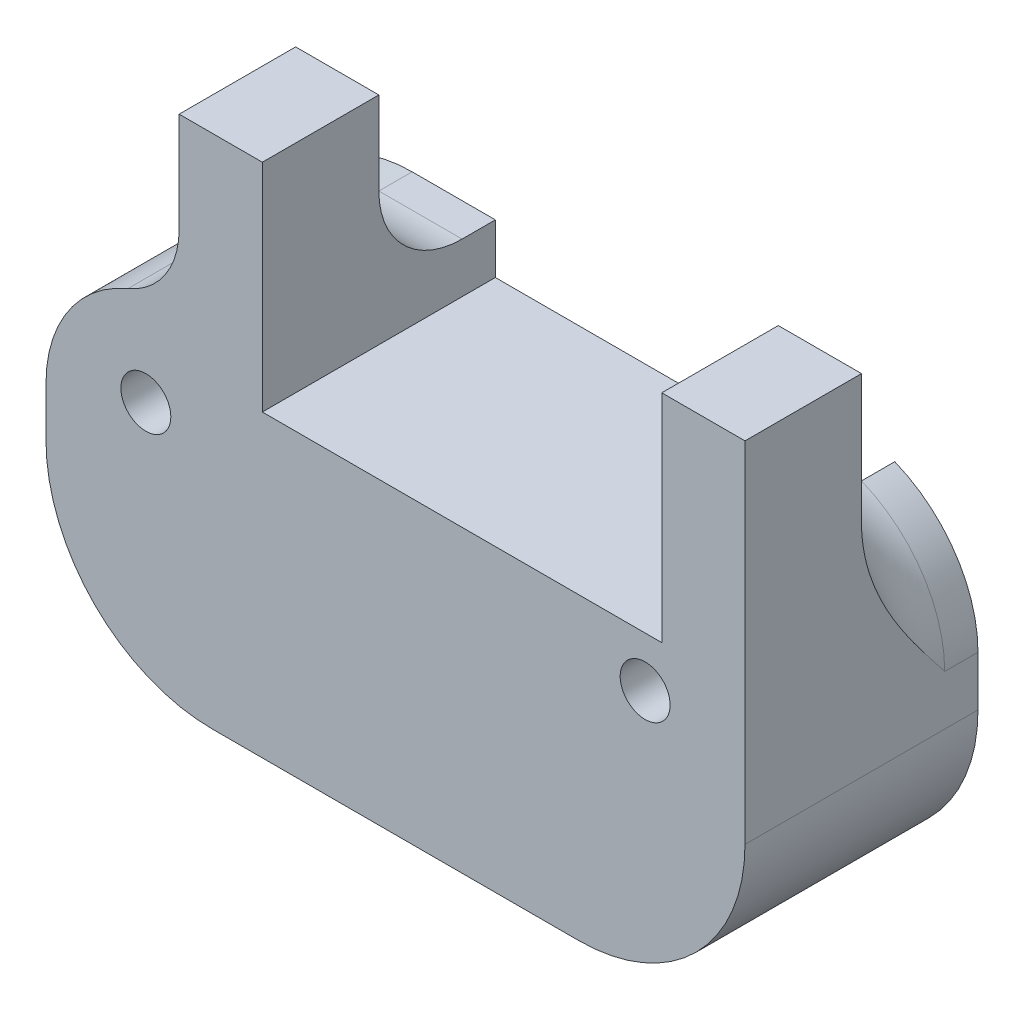
ISO-10303-21;
HEADER;
FILE_DESCRIPTION(('STEP AP214'),'2;1');
FILE_NAME('part.step','',(''),(''),'','','');
FILE_SCHEMA(('AUTOMOTIVE_DESIGN { 1 0 10303 214 1 1 1 1 }'));
ENDSEC;
DATA;
#1=APPLICATION_CONTEXT('core data for automotive mechanical design processes');
#2=APPLICATION_PROTOCOL_DEFINITION('international standard','automotive_design',2000,#1);
#3=PRODUCT_CONTEXT('',#1,'mechanical');
#4=PRODUCT('Part','Part','',(#3));
#5=PRODUCT_RELATED_PRODUCT_CATEGORY('part','',(#4));
#6=PRODUCT_DEFINITION_FORMATION('','',#4);
#7=PRODUCT_DEFINITION_CONTEXT('part definition',#1,'design');
#8=PRODUCT_DEFINITION('design','',#6,#7);
#9=PRODUCT_DEFINITION_SHAPE('','',#8);
#10=(LENGTH_UNIT() NAMED_UNIT(*) SI_UNIT(.MILLI.,.METRE.));
#11=(NAMED_UNIT(*) PLANE_ANGLE_UNIT() SI_UNIT($,.RADIAN.));
#12=(NAMED_UNIT(*) SI_UNIT($,.STERADIAN.) SOLID_ANGLE_UNIT());
#13=UNCERTAINTY_MEASURE_WITH_UNIT(LENGTH_MEASURE(1.E-05),#10,'distance_accuracy_value','');
#14=(GEOMETRIC_REPRESENTATION_CONTEXT(3) GLOBAL_UNCERTAINTY_ASSIGNED_CONTEXT((#13)) GLOBAL_UNIT_ASSIGNED_CONTEXT((#10,
#11,#12)) REPRESENTATION_CONTEXT('',''));
#15=CARTESIAN_POINT('',(0.,0.,0.));
#16=DIRECTION('',(0.,0.,1.));
#17=DIRECTION('',(1.,0.,0.));
#18=AXIS2_PLACEMENT_3D('',#15,#16,#17);
#19=CARTESIAN_POINT('',(-14.0928347928163,14.5093575102934,14.));
#20=DIRECTION('',(0.,-1.,0.));
#21=DIRECTION('',(0.,0.,-1.));
#22=AXIS2_PLACEMENT_3D('',#19,#20,#21);
#23=PLANE('',#22);
#24=DIRECTION('',(-1.,0.,0.));
#25=VECTOR('',#24,1.);
#26=CARTESIAN_POINT('',(-35.0928347928163,14.5093575102934,2.));
#27=LINE('',#26,#25);
#28=CARTESIAN_POINT('',(-40.0928347928163,14.5093575102934,2.));
#29=VERTEX_POINT('',#28);
#30=CARTESIAN_POINT('',(-35.0928347928163,14.5093575102934,2.));
#31=VERTEX_POINT('',#30);
#32=EDGE_CURVE('E322',#29,#31,#27,.F.);
#33=ORIENTED_EDGE('',*,*,#32,.T.);
#34=DIRECTION('',(0.,0.,1.));
#35=VECTOR('',#34,1.);
#36=CARTESIAN_POINT('',(-35.0928347928163,14.5093575102934,0.));
#37=LINE('',#36,#35);
#38=CARTESIAN_POINT('',(-35.0928347928163,14.5093575102934,0.));
#39=VERTEX_POINT('',#38);
#40=EDGE_CURVE('E64',#39,#31,#37,.T.);
#41=ORIENTED_EDGE('',*,*,#40,.F.);
#42=DIRECTION('',(-1.,0.,0.));
#43=VECTOR('',#42,1.);
#44=CARTESIAN_POINT('',(-14.0928347928163,14.5093575102934,0.));
#45=LINE('',#44,#43);
#46=CARTESIAN_POINT('',(-40.0928347928163,14.5093575102934,0.));
#47=VERTEX_POINT('',#46);
#48=EDGE_CURVE('E197',#39,#47,#45,.T.);
#49=ORIENTED_EDGE('',*,*,#48,.T.);
#50=DIRECTION('',(0.,0.,-1.));
#51=VECTOR('',#50,1.);
#52=CARTESIAN_POINT('',(-40.0928347928163,14.5093575102934,14.));
#53=LINE('',#52,#51);
#54=EDGE_CURVE('E304',#29,#47,#53,.T.);
#55=ORIENTED_EDGE('',*,*,#54,.F.);
#56=EDGE_LOOP('',(#33,#41,#49,#55));
#57=FACE_BOUND('',#56,.T.);
#58=ADVANCED_FACE('F40',(#57),#23,.F.);
#59=CARTESIAN_POINT('',(-14.0928347928163,6.50935751029341,14.));
#60=DIRECTION('',(0.,0.,1.));
#61=DIRECTION('',(1.,0.,0.));
#62=AXIS2_PLACEMENT_3D('',#59,#60,#61);
#63=PLANE('',#62);
#64=DIRECTION('',(1.,0.,0.));
#65=VECTOR('',#64,1.);
#66=CARTESIAN_POINT('',(-35.0928347928163,11.5093575102934,14.));
#67=LINE('',#66,#65);
#68=CARTESIAN_POINT('',(-35.0928347928163,11.5093575102934,14.));
#69=VERTEX_POINT('',#68);
#70=CARTESIAN_POINT('',(-11.0928347928163,11.5093575102934,14.));
#71=VERTEX_POINT('',#70);
#72=EDGE_CURVE('E198',#69,#71,#67,.T.);
#73=ORIENTED_EDGE('',*,*,#72,.F.);
#74=DIRECTION('',(0.,-1.,0.));
#75=VECTOR('',#74,1.);
#76=CARTESIAN_POINT('',(-35.0928347928163,24.5093575102934,14.));
#77=LINE('',#76,#75);
#78=CARTESIAN_POINT('',(-35.0928347928163,24.5093575102934,14.));
#79=VERTEX_POINT('',#78);
#80=EDGE_CURVE('E178',#79,#69,#77,.T.);
#81=ORIENTED_EDGE('',*,*,#80,.F.);
#82=DIRECTION('',(1.,0.,0.));
#83=VECTOR('',#82,1.);
#84=CARTESIAN_POINT('',(0.,24.5093575102934,14.));
#85=LINE('',#84,#83);
#86=CARTESIAN_POINT('',(-40.0928347928163,24.5093575102934,14.));
#87=VERTEX_POINT('',#86);
#88=EDGE_CURVE('E216',#87,#79,#85,.T.);
#89=ORIENTED_EDGE('',*,*,#88,.F.);
#90=DIRECTION('',(0.,-1.,0.));
#91=VECTOR('',#90,1.);
#92=CARTESIAN_POINT('',(-40.0928347928163,24.5093575102934,14.));
#93=LINE('',#92,#91);
#94=CARTESIAN_POINT('',(-40.0928347928163,18.5093575102934,14.));
#95=VERTEX_POINT('',#94);
#96=EDGE_CURVE('E219',#87,#95,#93,.T.);
#97=ORIENTED_EDGE('',*,*,#96,.T.);
#98=CARTESIAN_POINT('',(-45.0928347928163,18.5093575102934,14.));
#99=DIRECTION('',(0.,0.,1.));
#100=DIRECTION('',(1.,0.,0.));
#101=AXIS2_PLACEMENT_3D('',#98,#99,#100);
#102=CIRCLE('',#101,5.);
#103=CARTESIAN_POINT('',(-43.1697578697394,13.8939728949088,14.));
#104=VERTEX_POINT('',#103);
#105=EDGE_CURVE('E324',#95,#104,#102,.F.);
#106=ORIENTED_EDGE('',*,*,#105,.T.);
#107=CARTESIAN_POINT('',(-40.0928347928163,6.50935751029341,14.));
#108=DIRECTION('',(0.,0.,1.));
#109=DIRECTION('',(1.,0.,0.));
#110=AXIS2_PLACEMENT_3D('',#107,#108,#109);
#111=CIRCLE('',#110,8.);
#112=CARTESIAN_POINT('',(-48.0928347928163,6.50935751029341,14.));
#113=VERTEX_POINT('',#112);
#114=EDGE_CURVE('E259',#104,#113,#111,.T.);
#115=ORIENTED_EDGE('',*,*,#114,.T.);
#116=DIRECTION('',(0.,-1.,0.));
#117=VECTOR('',#116,1.);
#118=CARTESIAN_POINT('',(-48.0928347928163,6.50935751029341,14.));
#119=LINE('',#118,#117);
#120=CARTESIAN_POINT('',(-48.0928347928163,3.50935751029348,14.));
#121=VERTEX_POINT('',#120);
#122=EDGE_CURVE('E261',#113,#121,#119,.T.);
#123=ORIENTED_EDGE('',*,*,#122,.T.);
#124=CARTESIAN_POINT('',(-38.0928347928163,3.50935751029341,14.));
#125=DIRECTION('',(0.,0.,1.));
#126=DIRECTION('',(1.,0.,0.));
#127=AXIS2_PLACEMENT_3D('',#124,#125,#126);
#128=CIRCLE('',#127,10.);
#129=CARTESIAN_POINT('',(-38.0928347928163,-6.49064248970659,14.));
#130=VERTEX_POINT('',#129);
#131=EDGE_CURVE('E264',#121,#130,#128,.T.);
#132=ORIENTED_EDGE('',*,*,#131,.T.);
#133=DIRECTION('',(1.,0.,0.));
#134=VECTOR('',#133,1.);
#135=CARTESIAN_POINT('',(-38.0928347928163,-6.49064248970659,14.));
#136=LINE('',#135,#134);
#137=CARTESIAN_POINT('',(-16.0928347928163,-6.49064248970659,14.));
#138=VERTEX_POINT('',#137);
#139=EDGE_CURVE('E266',#130,#138,#136,.T.);
#140=ORIENTED_EDGE('',*,*,#139,.T.);
#141=CARTESIAN_POINT('',(-16.0928347928163,3.50935751029341,14.));
#142=DIRECTION('',(0.,0.,1.));
#143=DIRECTION('',(1.,0.,0.));
#144=AXIS2_PLACEMENT_3D('',#141,#142,#143);
#145=CIRCLE('',#144,10.);
#146=CARTESIAN_POINT('',(-6.09283479281634,3.50935751029341,14.));
#147=VERTEX_POINT('',#146);
#148=EDGE_CURVE('E268',#138,#147,#145,.T.);
#149=ORIENTED_EDGE('',*,*,#148,.T.);
#150=DIRECTION('',(0.,1.,0.));
#151=VECTOR('',#150,1.);
#152=CARTESIAN_POINT('',(-6.09283479281634,3.50935751029341,14.));
#153=LINE('',#152,#151);
#154=CARTESIAN_POINT('',(-6.09283479281634,24.5093575102934,14.));
#155=VERTEX_POINT('',#154);
#156=EDGE_CURVE('E270',#147,#155,#153,.T.);
#157=ORIENTED_EDGE('',*,*,#156,.T.);
#158=DIRECTION('',(-1.,0.,0.));
#159=VECTOR('',#158,1.);
#160=CARTESIAN_POINT('',(0.,24.5093575102934,14.));
#161=LINE('',#160,#159);
#162=CARTESIAN_POINT('',(-11.0928347928163,24.5093575102934,14.));
#163=VERTEX_POINT('',#162);
#164=EDGE_CURVE('E237',#155,#163,#161,.T.);
#165=ORIENTED_EDGE('',*,*,#164,.T.);
#166=DIRECTION('',(0.,1.,0.));
#167=VECTOR('',#166,1.);
#168=CARTESIAN_POINT('',(-11.0928347928163,-6.49264248970659,14.));
#169=LINE('',#168,#167);
#170=EDGE_CURVE('E241',#71,#163,#169,.T.);
#171=ORIENTED_EDGE('',*,*,#170,.F.);
#172=EDGE_LOOP('',(#73,#81,#89,#97,#106,#115,#123,#132,#140,#149,#157,#165,#171));
#173=FACE_BOUND('',#172,.T.);
#174=CARTESIAN_POINT('',(-42.0928347928163,8.50935751029341,14.));
#175=DIRECTION('',(0.,0.,1.));
#176=DIRECTION('',(1.,0.,0.));
#177=AXIS2_PLACEMENT_3D('',#174,#175,#176);
#178=CIRCLE('',#177,1.5);
#179=CARTESIAN_POINT('',(-40.5928347928163,8.50935751029341,14.));
#180=VERTEX_POINT('',#179);
#181=EDGE_CURVE('E253',#180,#180,#178,.T.);
#182=ORIENTED_EDGE('',*,*,#181,.F.);
#183=EDGE_LOOP('',(#182));
#184=FACE_BOUND('',#183,.T.);
#185=CARTESIAN_POINT('',(-12.0928347928163,8.50935751029341,14.));
#186=DIRECTION('',(0.,0.,1.));
#187=DIRECTION('',(1.,0.,0.));
#188=AXIS2_PLACEMENT_3D('',#185,#186,#187);
#189=CIRCLE('',#188,1.5);
#190=CARTESIAN_POINT('',(-10.5928347928163,8.50935751029341,14.));
#191=VERTEX_POINT('',#190);
#192=EDGE_CURVE('E247',#191,#191,#189,.T.);
#193=ORIENTED_EDGE('',*,*,#192,.F.);
#194=EDGE_LOOP('',(#193));
#195=FACE_BOUND('',#194,.T.);
#196=ADVANCED_FACE('F358',(#173,#184,#195),#63,.T.);
#197=CARTESIAN_POINT('',(-14.0928347928163,6.50935751029341,0.));
#198=DIRECTION('',(0.,0.,1.));
#199=DIRECTION('',(1.,0.,0.));
#200=AXIS2_PLACEMENT_3D('',#197,#198,#199);
#201=PLANE('',#200);
#202=ORIENTED_EDGE('',*,*,#48,.F.);
#203=DIRECTION('',(0.,-1.,0.));
#204=VECTOR('',#203,1.);
#205=CARTESIAN_POINT('',(-35.0928347928163,14.5093575102934,0.));
#206=LINE('',#205,#204);
#207=CARTESIAN_POINT('',(-35.0928347928163,11.5093575102934,0.));
#208=VERTEX_POINT('',#207);
#209=EDGE_CURVE('E175',#39,#208,#206,.T.);
#210=ORIENTED_EDGE('',*,*,#209,.T.);
#211=DIRECTION('',(1.,0.,0.));
#212=VECTOR('',#211,1.);
#213=CARTESIAN_POINT('',(-35.0928347928163,11.5093575102934,0.));
#214=LINE('',#213,#212);
#215=CARTESIAN_POINT('',(-11.0928347928163,11.5093575102934,0.));
#216=VERTEX_POINT('',#215);
#217=EDGE_CURVE('E186',#208,#216,#214,.T.);
#218=ORIENTED_EDGE('',*,*,#217,.T.);
#219=DIRECTION('',(0.,1.,0.));
#220=VECTOR('',#219,1.);
#221=CARTESIAN_POINT('',(-11.0928347928163,14.5093575102934,0.));
#222=LINE('',#221,#220);
#223=CARTESIAN_POINT('',(-11.0928347928163,13.9255559973891,0.));
#224=VERTEX_POINT('',#223);
#225=EDGE_CURVE('E183',#216,#224,#222,.T.);
#226=ORIENTED_EDGE('',*,*,#225,.T.);
#227=CARTESIAN_POINT('',(-14.0928347928163,6.50935751029341,0.));
#228=DIRECTION('',(0.,0.,1.));
#229=DIRECTION('',(1.,0.,0.));
#230=AXIS2_PLACEMENT_3D('',#227,#228,#229);
#231=CIRCLE('',#230,8.);
#232=CARTESIAN_POINT('',(-6.09283479281634,6.50935751029341,0.));
#233=VERTEX_POINT('',#232);
#234=EDGE_CURVE('E256',#233,#224,#231,.T.);
#235=ORIENTED_EDGE('',*,*,#234,.F.);
#236=DIRECTION('',(0.,1.,0.));
#237=VECTOR('',#236,1.);
#238=CARTESIAN_POINT('',(-6.09283479281634,3.50935751029341,0.));
#239=LINE('',#238,#237);
#240=CARTESIAN_POINT('',(-6.09283479281634,3.50935751029341,0.));
#241=VERTEX_POINT('',#240);
#242=EDGE_CURVE('E262',#241,#233,#239,.T.);
#243=ORIENTED_EDGE('',*,*,#242,.F.);
#244=CARTESIAN_POINT('',(-16.0928347928163,3.50935751029341,0.));
#245=DIRECTION('',(0.,0.,1.));
#246=DIRECTION('',(1.,0.,0.));
#247=AXIS2_PLACEMENT_3D('',#244,#245,#246);
#248=CIRCLE('',#247,10.);
#249=CARTESIAN_POINT('',(-16.0928347928163,-6.49064248970659,0.));
#250=VERTEX_POINT('',#249);
#251=EDGE_CURVE('E284',#250,#241,#248,.T.);
#252=ORIENTED_EDGE('',*,*,#251,.F.);
#253=DIRECTION('',(1.,0.,0.));
#254=VECTOR('',#253,1.);
#255=CARTESIAN_POINT('',(-38.0928347928163,-6.49064248970659,0.));
#256=LINE('',#255,#254);
#257=CARTESIAN_POINT('',(-38.0928347928163,-6.49064248970659,0.));
#258=VERTEX_POINT('',#257);
#259=EDGE_CURVE('E282',#258,#250,#256,.T.);
#260=ORIENTED_EDGE('',*,*,#259,.F.);
#261=CARTESIAN_POINT('',(-38.0928347928163,3.50935751029341,0.));
#262=DIRECTION('',(0.,0.,1.));
#263=DIRECTION('',(1.,0.,0.));
#264=AXIS2_PLACEMENT_3D('',#261,#262,#263);
#265=CIRCLE('',#264,10.);
#266=CARTESIAN_POINT('',(-48.0928347928163,3.50935751029348,0.));
#267=VERTEX_POINT('',#266);
#268=EDGE_CURVE('E280',#267,#258,#265,.T.);
#269=ORIENTED_EDGE('',*,*,#268,.F.);
#270=DIRECTION('',(0.,-1.,0.));
#271=VECTOR('',#270,1.);
#272=CARTESIAN_POINT('',(-48.0928347928163,6.50935751029341,0.));
#273=LINE('',#272,#271);
#274=CARTESIAN_POINT('',(-48.0928347928163,6.50935751029341,0.));
#275=VERTEX_POINT('',#274);
#276=EDGE_CURVE('E278',#275,#267,#273,.T.);
#277=ORIENTED_EDGE('',*,*,#276,.F.);
#278=CARTESIAN_POINT('',(-40.0928347928163,6.50935751029341,0.));
#279=DIRECTION('',(0.,0.,1.));
#280=DIRECTION('',(1.,0.,0.));
#281=AXIS2_PLACEMENT_3D('',#278,#279,#280);
#282=CIRCLE('',#281,8.);
#283=EDGE_CURVE('E276',#47,#275,#282,.T.);
#284=ORIENTED_EDGE('',*,*,#283,.F.);
#285=EDGE_LOOP('',(#202,#210,#218,#226,#235,#243,#252,#260,#269,#277,#284));
#286=FACE_BOUND('',#285,.T.);
#287=CARTESIAN_POINT('',(-42.0928347928163,8.50935751029341,0.));
#288=DIRECTION('',(0.,0.,1.));
#289=DIRECTION('',(1.,0.,0.));
#290=AXIS2_PLACEMENT_3D('',#287,#288,#289);
#291=CIRCLE('',#290,1.5);
#292=CARTESIAN_POINT('',(-40.5928347928163,8.50935751029341,0.));
#293=VERTEX_POINT('',#292);
#294=EDGE_CURVE('E250',#293,#293,#291,.T.);
#295=ORIENTED_EDGE('',*,*,#294,.T.);
#296=EDGE_LOOP('',(#295));
#297=FACE_BOUND('',#296,.T.);
#298=CARTESIAN_POINT('',(-12.0928347928163,8.50935751029341,0.));
#299=DIRECTION('',(0.,0.,1.));
#300=DIRECTION('',(1.,0.,0.));
#301=AXIS2_PLACEMENT_3D('',#298,#299,#300);
#302=CIRCLE('',#301,1.5);
#303=CARTESIAN_POINT('',(-10.5928347928163,8.50935751029341,0.));
#304=VERTEX_POINT('',#303);
#305=EDGE_CURVE('E243',#304,#304,#302,.T.);
#306=ORIENTED_EDGE('',*,*,#305,.T.);
#307=EDGE_LOOP('',(#306));
#308=FACE_BOUND('',#307,.T.);
#309=ADVANCED_FACE('F194',(#286,#297,#308),#201,.F.);
#310=CARTESIAN_POINT('',(-14.0928347928163,6.50935751029341,14.));
#311=DIRECTION('',(0.,0.,-1.));
#312=DIRECTION('',(-1.,0.,0.));
#313=AXIS2_PLACEMENT_3D('',#310,#311,#312);
#314=CYLINDRICAL_SURFACE('',#313,8.);
#315=ORIENTED_EDGE('',*,*,#234,.T.);
#316=DIRECTION('',(0.,0.,-1.));
#317=VECTOR('',#316,1.);
#318=CARTESIAN_POINT('',(-11.0928347928163,13.9255559973891,14.));
#319=LINE('',#318,#317);
#320=CARTESIAN_POINT('',(-11.0928347928163,13.9255559973891,2.00000000000003));
#321=VERTEX_POINT('',#320);
#322=EDGE_CURVE('E204',#224,#321,#319,.F.);
#323=ORIENTED_EDGE('',*,*,#322,.T.);
#324=CARTESIAN_POINT('',(-14.0928347928163,6.50935751029341,2.));
#325=DIRECTION('',(0.,0.,-1.));
#326=DIRECTION('',(-1.,0.,0.));
#327=AXIS2_PLACEMENT_3D('',#324,#325,#326);
#328=CIRCLE('',#327,8.);
#329=CARTESIAN_POINT('',(-6.09283479281634,6.50935751029341,2.));
#330=VERTEX_POINT('',#329);
#331=EDGE_CURVE('E317',#321,#330,#328,.T.);
#332=ORIENTED_EDGE('',*,*,#331,.T.);
#333=DIRECTION('',(0.,0.,-1.));
#334=VECTOR('',#333,1.);
#335=CARTESIAN_POINT('',(-6.09283479281634,6.50935751029341,14.));
#336=LINE('',#335,#334);
#337=EDGE_CURVE('E272',#330,#233,#336,.T.);
#338=ORIENTED_EDGE('',*,*,#337,.T.);
#339=EDGE_LOOP('',(#315,#323,#332,#338));
#340=FACE_BOUND('',#339,.T.);
#341=ADVANCED_FACE('F363',(#340),#314,.T.);
#342=CARTESIAN_POINT('',(-40.0928347928163,6.50935751029341,14.));
#343=DIRECTION('',(0.,0.,-1.));
#344=DIRECTION('',(-1.,0.,0.));
#345=AXIS2_PLACEMENT_3D('',#342,#343,#344);
#346=CYLINDRICAL_SURFACE('',#345,8.);
#347=ORIENTED_EDGE('',*,*,#114,.F.);
#348=DIRECTION('',(0.,0.,-1.));
#349=VECTOR('',#348,1.);
#350=CARTESIAN_POINT('',(-43.1697578697394,13.8939728949088,14.));
#351=LINE('',#350,#349);
#352=CARTESIAN_POINT('',(-43.1697578697394,13.8939728949088,2.));
#353=VERTEX_POINT('',#352);
#354=EDGE_CURVE('E309',#104,#353,#351,.T.);
#355=ORIENTED_EDGE('',*,*,#354,.T.);
#356=CARTESIAN_POINT('',(-40.0928347928163,6.50935751029341,2.));
#357=DIRECTION('',(0.,0.,1.));
#358=DIRECTION('',(1.,0.,0.));
#359=AXIS2_PLACEMENT_3D('',#356,#357,#358);
#360=CIRCLE('',#359,8.);
#361=EDGE_CURVE('E307',#353,#29,#360,.F.);
#362=ORIENTED_EDGE('',*,*,#361,.T.);
#363=ORIENTED_EDGE('',*,*,#54,.T.);
#364=ORIENTED_EDGE('',*,*,#283,.T.);
#365=DIRECTION('',(0.,0.,-1.));
#366=VECTOR('',#365,1.);
#367=CARTESIAN_POINT('',(-48.0928347928163,6.50935751029341,14.));
#368=LINE('',#367,#366);
#369=EDGE_CURVE('E301',#113,#275,#368,.T.);
#370=ORIENTED_EDGE('',*,*,#369,.F.);
#371=EDGE_LOOP('',(#347,#355,#362,#363,#364,#370));
#372=FACE_BOUND('',#371,.T.);
#373=ADVANCED_FACE('F383',(#372),#346,.T.);
#374=CARTESIAN_POINT('',(-48.0928347928163,6.50935751029341,14.));
#375=DIRECTION('',(1.,0.,0.));
#376=DIRECTION('',(0.,0.,-1.));
#377=AXIS2_PLACEMENT_3D('',#374,#375,#376);
#378=PLANE('',#377);
#379=ORIENTED_EDGE('',*,*,#276,.T.);
#380=DIRECTION('',(0.,0.,-1.));
#381=VECTOR('',#380,1.);
#382=CARTESIAN_POINT('',(-48.0928347928163,3.50935751029348,14.));
#383=LINE('',#382,#381);
#384=EDGE_CURVE('E298',#121,#267,#383,.T.);
#385=ORIENTED_EDGE('',*,*,#384,.F.);
#386=ORIENTED_EDGE('',*,*,#122,.F.);
#387=ORIENTED_EDGE('',*,*,#369,.T.);
#388=EDGE_LOOP('',(#379,#385,#386,#387));
#389=FACE_BOUND('',#388,.T.);
#390=ADVANCED_FACE('F379',(#389),#378,.F.);
#391=CARTESIAN_POINT('',(-38.0928347928163,3.50935751029341,14.));
#392=DIRECTION('',(0.,0.,-1.));
#393=DIRECTION('',(-1.,0.,0.));
#394=AXIS2_PLACEMENT_3D('',#391,#392,#393);
#395=CYLINDRICAL_SURFACE('',#394,10.);
#396=ORIENTED_EDGE('',*,*,#268,.T.);
#397=DIRECTION('',(0.,0.,-1.));
#398=VECTOR('',#397,1.);
#399=CARTESIAN_POINT('',(-38.0928347928163,-6.49064248970659,14.));
#400=LINE('',#399,#398);
#401=EDGE_CURVE('E295',#130,#258,#400,.T.);
#402=ORIENTED_EDGE('',*,*,#401,.F.);
#403=ORIENTED_EDGE('',*,*,#131,.F.);
#404=ORIENTED_EDGE('',*,*,#384,.T.);
#405=EDGE_LOOP('',(#396,#402,#403,#404));
#406=FACE_BOUND('',#405,.T.);
#407=ADVANCED_FACE('F375',(#406),#395,.T.);
#408=CARTESIAN_POINT('',(-38.0928347928163,-6.49064248970659,14.));
#409=DIRECTION('',(0.,1.,0.));
#410=DIRECTION('',(0.,0.,1.));
#411=AXIS2_PLACEMENT_3D('',#408,#409,#410);
#412=PLANE('',#411);
#413=ORIENTED_EDGE('',*,*,#259,.T.);
#414=DIRECTION('',(0.,0.,-1.));
#415=VECTOR('',#414,1.);
#416=CARTESIAN_POINT('',(-16.0928347928163,-6.49064248970659,14.));
#417=LINE('',#416,#415);
#418=EDGE_CURVE('E292',#138,#250,#417,.T.);
#419=ORIENTED_EDGE('',*,*,#418,.F.);
#420=ORIENTED_EDGE('',*,*,#139,.F.);
#421=ORIENTED_EDGE('',*,*,#401,.T.);
#422=EDGE_LOOP('',(#413,#419,#420,#421));
#423=FACE_BOUND('',#422,.T.);
#424=ADVANCED_FACE('F371',(#423),#412,.F.);
#425=CARTESIAN_POINT('',(-16.0928347928163,3.50935751029341,14.));
#426=DIRECTION('',(0.,0.,-1.));
#427=DIRECTION('',(-1.,0.,0.));
#428=AXIS2_PLACEMENT_3D('',#425,#426,#427);
#429=CYLINDRICAL_SURFACE('',#428,10.);
#430=ORIENTED_EDGE('',*,*,#251,.T.);
#431=DIRECTION('',(0.,0.,-1.));
#432=VECTOR('',#431,1.);
#433=CARTESIAN_POINT('',(-6.09283479281634,3.50935751029341,14.));
#434=LINE('',#433,#432);
#435=EDGE_CURVE('E289',#147,#241,#434,.T.);
#436=ORIENTED_EDGE('',*,*,#435,.F.);
#437=ORIENTED_EDGE('',*,*,#148,.F.);
#438=ORIENTED_EDGE('',*,*,#418,.T.);
#439=EDGE_LOOP('',(#430,#436,#437,#438));
#440=FACE_BOUND('',#439,.T.);
#441=ADVANCED_FACE('F367',(#440),#429,.T.);
#442=CARTESIAN_POINT('',(-6.09283479281634,3.50935751029341,14.));
#443=DIRECTION('',(-1.,0.,0.));
#444=DIRECTION('',(0.,-1.,0.));
#445=AXIS2_PLACEMENT_3D('',#442,#443,#444);
#446=PLANE('',#445);
#447=ORIENTED_EDGE('',*,*,#242,.T.);
#448=ORIENTED_EDGE('',*,*,#337,.F.);
#449=CARTESIAN_POINT('',(-6.09283479281634,16.756308276253,7.));
#450=CARTESIAN_POINT('',(-6.09283479281634,16.2284001356341,6.99989226795609));
#451=CARTESIAN_POINT('',(-6.09283479281634,15.7034192567662,6.94821090361514));
#452=CARTESIAN_POINT('',(-6.09283479281634,14.9309925745403,6.80805569405686));
#453=CARTESIAN_POINT('',(-6.09283479281634,14.6777495331407,6.75150880740278));
#454=CARTESIAN_POINT('',(-6.09283479281634,14.1759766701597,6.62011111733499));
#455=CARTESIAN_POINT('',(-6.09283479281634,13.9274497033896,6.54524958576136));
#456=CARTESIAN_POINT('',(-6.09283479281634,13.2849465671771,6.32844672899399));
#457=CARTESIAN_POINT('',(-6.09283479281634,12.8953263481385,6.17353594562127));
#458=CARTESIAN_POINT('',(-6.09283479281634,12.1312004089945,5.82997792960045));
#459=CARTESIAN_POINT('',(-6.09283479281634,11.7567076250536,5.64130254179929));
#460=CARTESIAN_POINT('',(-6.09283479281634,11.0198344006093,5.23642154556606));
#461=CARTESIAN_POINT('',(-6.09283479281634,10.6575508339124,5.02004154794773));
#462=CARTESIAN_POINT('',(-6.09283479281634,9.94578101897938,4.56751557571757));
#463=CARTESIAN_POINT('',(-6.09283479281634,9.59629283787279,4.33137260435656));
#464=CARTESIAN_POINT('',(-6.09283479281634,8.78417705712817,3.7584773254803));
#465=CARTESIAN_POINT('',(-6.09283479281633,8.32570038517075,3.41590356128897));
#466=CARTESIAN_POINT('',(-6.09283479281635,7.41927635953472,2.7192544924996));
#467=CARTESIAN_POINT('',(-6.09283479281636,6.97130945278873,2.36520404877805));
#468=CARTESIAN_POINT('',(-6.09283479281634,6.51871279600494,2.00739600227944));
#469=CARTESIAN_POINT('',(-6.09283479281634,6.51403515323366,2.00369800096109));
#470=CARTESIAN_POINT('',(-6.09283479281634,6.50935751029341,2.));
#471=B_SPLINE_CURVE_WITH_KNOTS('',3,(#449,#450,#451,#452,#453,#454,#455,#456,#457,#458,#459,
#460,#461,#462,#463,#464,#465,#466,#467,#468,#469,#470),.UNSPECIFIED.,.F.,.F.,(4,2,2,2,2,2,2,2,
2,2,4),(0.,1.5769511441326,2.35459089538788,3.13268725954596,4.38837930323982,5.64512334656462,
6.91020750719188,8.175099769059,9.89155653655214,11.6045154477906,11.6224039916106),.UNSPECIFIED.);
#472=CARTESIAN_POINT('',(-6.09283479281634,16.756308276253,7.));
#473=VERTEX_POINT('',#472);
#474=EDGE_CURVE('E333',#330,#473,#471,.F.);
#475=ORIENTED_EDGE('',*,*,#474,.T.);
#476=DIRECTION('',(0.,1.,0.));
#477=VECTOR('',#476,1.);
#478=CARTESIAN_POINT('',(-6.09283479281634,-6.49264248970659,7.));
#479=LINE('',#478,#477);
#480=CARTESIAN_POINT('',(-6.09283479281634,24.5093575102934,7.));
#481=VERTEX_POINT('',#480);
#482=EDGE_CURVE('E240',#473,#481,#479,.T.);
#483=ORIENTED_EDGE('',*,*,#482,.T.);
#484=DIRECTION('',(0.,0.,-1.));
#485=VECTOR('',#484,1.);
#486=CARTESIAN_POINT('',(-6.09283479281634,24.5093575102934,0.));
#487=LINE('',#486,#485);
#488=EDGE_CURVE('E228',#155,#481,#487,.T.);
#489=ORIENTED_EDGE('',*,*,#488,.F.);
#490=ORIENTED_EDGE('',*,*,#156,.F.);
#491=ORIENTED_EDGE('',*,*,#435,.T.);
#492=EDGE_LOOP('',(#447,#448,#475,#483,#489,#490,#491));
#493=FACE_BOUND('',#492,.T.);
#494=ADVANCED_FACE('F356',(#493),#446,.F.);
#495=CARTESIAN_POINT('',(-42.0928347928163,8.50935751029341,14.));
#496=DIRECTION('',(0.,0.,-1.));
#497=DIRECTION('',(-1.,0.,0.));
#498=AXIS2_PLACEMENT_3D('',#495,#496,#497);
#499=CYLINDRICAL_SURFACE('',#498,1.5);
#500=ORIENTED_EDGE('',*,*,#181,.T.);
#501=EDGE_LOOP('',(#500));
#502=FACE_BOUND('',#501,.T.);
#503=ORIENTED_EDGE('',*,*,#294,.F.);
#504=EDGE_LOOP('',(#503));
#505=FACE_BOUND('',#504,.T.);
#506=ADVANCED_FACE('F352',(#502,#505),#499,.F.);
#507=CARTESIAN_POINT('',(-12.0928347928163,8.50935751029341,14.));
#508=DIRECTION('',(0.,0.,-1.));
#509=DIRECTION('',(-1.,0.,0.));
#510=AXIS2_PLACEMENT_3D('',#507,#508,#509);
#511=CYLINDRICAL_SURFACE('',#510,1.5);
#512=ORIENTED_EDGE('',*,*,#192,.T.);
#513=EDGE_LOOP('',(#512));
#514=FACE_BOUND('',#513,.T.);
#515=ORIENTED_EDGE('',*,*,#305,.F.);
#516=EDGE_LOOP('',(#515));
#517=FACE_BOUND('',#516,.T.);
#518=ADVANCED_FACE('F348',(#514,#517),#511,.F.);
#519=CARTESIAN_POINT('',(0.,-6.49264248970659,7.));
#520=DIRECTION('',(0.,0.,-1.));
#521=DIRECTION('',(-1.,0.,0.));
#522=AXIS2_PLACEMENT_3D('',#519,#520,#521);
#523=PLANE('',#522);
#524=ORIENTED_EDGE('',*,*,#482,.F.);
#525=CARTESIAN_POINT('',(-14.0928347928163,6.50935751029341,7.));
#526=DIRECTION('',(0.,0.,-1.));
#527=DIRECTION('',(-1.,0.,0.));
#528=AXIS2_PLACEMENT_3D('',#525,#526,#527);
#529=CIRCLE('',#528,13.);
#530=CARTESIAN_POINT('',(-11.0928347928163,19.1584681509669,7.));
#531=VERTEX_POINT('',#530);
#532=EDGE_CURVE('E314',#473,#531,#529,.F.);
#533=ORIENTED_EDGE('',*,*,#532,.T.);
#534=DIRECTION('',(0.,1.,0.));
#535=VECTOR('',#534,1.);
#536=CARTESIAN_POINT('',(-11.0928347928163,-6.49264248970659,7.));
#537=LINE('',#536,#535);
#538=CARTESIAN_POINT('',(-11.0928347928163,24.5093575102934,7.));
#539=VERTEX_POINT('',#538);
#540=EDGE_CURVE('E244',#531,#539,#537,.T.);
#541=ORIENTED_EDGE('',*,*,#540,.T.);
#542=DIRECTION('',(-1.,0.,0.));
#543=VECTOR('',#542,1.);
#544=CARTESIAN_POINT('',(0.,24.5093575102934,7.));
#545=LINE('',#544,#543);
#546=EDGE_CURVE('E231',#481,#539,#545,.T.);
#547=ORIENTED_EDGE('',*,*,#546,.F.);
#548=EDGE_LOOP('',(#524,#533,#541,#547));
#549=FACE_BOUND('',#548,.T.);
#550=ADVANCED_FACE('F346',(#549),#523,.T.);
#551=CARTESIAN_POINT('',(-11.0928347928163,-6.49264248970659,0.));
#552=DIRECTION('',(1.,0.,0.));
#553=DIRECTION('',(0.,0.,-1.));
#554=AXIS2_PLACEMENT_3D('',#551,#552,#553);
#555=PLANE('',#554);
#556=CARTESIAN_POINT('',(-11.0928347928163,19.1584681509669,7.));
#557=CARTESIAN_POINT('',(-11.0928347928163,19.00816110382,7.00001459822265));
#558=CARTESIAN_POINT('',(-11.0928347928163,18.8578624260152,6.99358396260933));
#559=CARTESIAN_POINT('',(-11.0928347928163,18.5583676459275,6.96801422463792));
#560=CARTESIAN_POINT('',(-11.0928347928163,18.4091714083705,6.94887670855854));
#561=CARTESIAN_POINT('',(-11.0928347928163,18.1130550764747,6.89809669425876));
#562=CARTESIAN_POINT('',(-11.0928347928163,17.9661331568315,6.86646482903877));
#563=CARTESIAN_POINT('',(-11.0928347928163,17.6754648530186,6.79097089578815));
#564=CARTESIAN_POINT('',(-11.0928347928163,17.5317185100848,6.74710866904302));
#565=CARTESIAN_POINT('',(-11.0928347928163,17.2484191462552,6.64749529294176));
#566=CARTESIAN_POINT('',(-11.0928347928163,17.1088658017878,6.59174506367909));
#567=CARTESIAN_POINT('',(-11.0928347928163,16.8348673001928,6.46873111015955));
#568=CARTESIAN_POINT('',(-11.0928347928163,16.7004240463898,6.40146314633129));
#569=CARTESIAN_POINT('',(-11.0928347928163,16.4376937949819,6.255906962998));
#570=CARTESIAN_POINT('',(-11.0928347928163,16.3094049488646,6.17762208063081));
#571=CARTESIAN_POINT('',(-11.0928347928163,16.0598298829869,6.01049866832279));
#572=CARTESIAN_POINT('',(-11.0928347928163,15.9385460897702,5.92165651354998));
#573=CARTESIAN_POINT('',(-11.0928347928163,15.7035603497322,5.73369570714997));
#574=CARTESIAN_POINT('',(-11.0928347928163,15.5898846958942,5.6345441659441));
#575=CARTESIAN_POINT('',(-11.0928347928163,15.3714745890615,5.42684044218302));
#576=CARTESIAN_POINT('',(-11.0928347928163,15.2667398260497,5.31828858583826));
#577=CARTESIAN_POINT('',(-11.0928347928163,15.067073396567,5.09242955204377));
#578=CARTESIAN_POINT('',(-11.0928347928163,14.9721457443331,4.97511882300044));
#579=CARTESIAN_POINT('',(-11.0928347928163,14.7930775743644,4.73260428833083));
#580=CARTESIAN_POINT('',(-11.0928347928163,14.7089323467258,4.60740396487997));
#581=CARTESIAN_POINT('',(-11.0928347928163,14.5546667909933,4.35389038948071));
#582=CARTESIAN_POINT('',(-11.0928347928163,14.4841947941272,4.22579120533308));
#583=CARTESIAN_POINT('',(-11.0928347928163,14.3549507679037,3.96388628012454));
#584=CARTESIAN_POINT('',(-11.0928347928163,14.2961732393267,3.83008325735757));
#585=CARTESIAN_POINT('',(-11.0928347928163,14.1910399839338,3.55786295706622));
#586=CARTESIAN_POINT('',(-11.0928347928163,14.1446692658556,3.41945147756906));
#587=CARTESIAN_POINT('',(-11.0928347928163,14.0648697858605,3.13900610157504));
#588=CARTESIAN_POINT('',(-11.0928347928163,14.0314352486783,2.99697385180238));
#589=CARTESIAN_POINT('',(-11.0928347928163,13.9784279498692,2.71294957699282));
#590=CARTESIAN_POINT('',(-11.0928347928163,13.9586198877562,2.57100150335965));
#591=CARTESIAN_POINT('',(-11.0928347928163,13.932174673758,2.28603912631798));
#592=CARTESIAN_POINT('',(-11.0928347928163,13.9255234404684,2.14302612746146));
#593=CARTESIAN_POINT('',(-11.0928347928163,13.9255559973891,2.));
#594=B_SPLINE_CURVE_WITH_KNOTS('',3,(#556,#557,#558,#559,#560,#561,#562,#563,#564,#565,#566,
#567,#568,#569,#570,#571,#572,#573,#574,#575,#576,#577,#578,#579,#580,#581,#582,#583,#584,#585,
#586,#587,#588,#589,#590,#591,#592,#593),.UNSPECIFIED.,.F.,.F.,(4,2,2,2,2,2,2,2,2,2,2,2,2,2,2,2,
2,2,4),(0.,0.450771617915255,0.90148697379068,1.35181958330958,1.80215803710648,
2.25246164878711,2.70293137079708,3.15326493343476,3.6037535669862,4.05572623905134,
4.50768323300589,4.95982449465479,5.41176757692241,5.84981505969248,6.28765606513948,
6.72496560929757,7.16207969384062,7.59144231634773,8.02034515426609),.UNSPECIFIED.);
#595=EDGE_CURVE('E326',#531,#321,#594,.T.);
#596=ORIENTED_EDGE('',*,*,#595,.T.);
#597=ORIENTED_EDGE('',*,*,#322,.F.);
#598=ORIENTED_EDGE('',*,*,#225,.F.);
#599=DIRECTION('',(0.,0.,1.));
#600=VECTOR('',#599,1.);
#601=CARTESIAN_POINT('',(-11.0928347928163,11.5093575102934,0.));
#602=LINE('',#601,#600);
#603=EDGE_CURVE('E182',#216,#71,#602,.T.);
#604=ORIENTED_EDGE('',*,*,#603,.T.);
#605=ORIENTED_EDGE('',*,*,#170,.T.);
#606=DIRECTION('',(0.,0.,-1.));
#607=VECTOR('',#606,1.);
#608=CARTESIAN_POINT('',(-11.0928347928163,24.5093575102934,0.));
#609=LINE('',#608,#607);
#610=EDGE_CURVE('E234',#163,#539,#609,.T.);
#611=ORIENTED_EDGE('',*,*,#610,.T.);
#612=ORIENTED_EDGE('',*,*,#540,.F.);
#613=EDGE_LOOP('',(#596,#597,#598,#604,#605,#611,#612));
#614=FACE_BOUND('',#613,.T.);
#615=ADVANCED_FACE('F340',(#614),#555,.F.);
#616=CARTESIAN_POINT('',(0.,24.5093575102934,0.));
#617=DIRECTION('',(0.,1.,0.));
#618=DIRECTION('',(0.,0.,1.));
#619=AXIS2_PLACEMENT_3D('',#616,#617,#618);
#620=PLANE('',#619);
#621=ORIENTED_EDGE('',*,*,#488,.T.);
#622=ORIENTED_EDGE('',*,*,#546,.T.);
#623=ORIENTED_EDGE('',*,*,#610,.F.);
#624=ORIENTED_EDGE('',*,*,#164,.F.);
#625=EDGE_LOOP('',(#621,#622,#623,#624));
#626=FACE_BOUND('',#625,.T.);
#627=ADVANCED_FACE('F345',(#626),#620,.T.);
#628=CARTESIAN_POINT('',(-35.0928347928163,24.5093575102934,0.));
#629=DIRECTION('',(-1.,0.,0.));
#630=DIRECTION('',(0.,0.,1.));
#631=AXIS2_PLACEMENT_3D('',#628,#629,#630);
#632=PLANE('',#631);
#633=ORIENTED_EDGE('',*,*,#80,.T.);
#634=DIRECTION('',(0.,0.,1.));
#635=VECTOR('',#634,1.);
#636=CARTESIAN_POINT('',(-35.0928347928163,11.5093575102934,0.));
#637=LINE('',#636,#635);
#638=EDGE_CURVE('E171',#208,#69,#637,.T.);
#639=ORIENTED_EDGE('',*,*,#638,.F.);
#640=ORIENTED_EDGE('',*,*,#209,.F.);
#641=ORIENTED_EDGE('',*,*,#40,.T.);
#642=CARTESIAN_POINT('',(-35.0928347928163,19.5093575102934,2.));
#643=DIRECTION('',(-1.,0.,0.));
#644=DIRECTION('',(0.,0.,1.));
#645=AXIS2_PLACEMENT_3D('',#642,#643,#644);
#646=CIRCLE('',#645,5.);
#647=CARTESIAN_POINT('',(-35.0928347928163,19.5093575102934,7.));
#648=VERTEX_POINT('',#647);
#649=EDGE_CURVE('E11',#31,#648,#646,.T.);
#650=ORIENTED_EDGE('',*,*,#649,.T.);
#651=DIRECTION('',(0.,-1.,0.));
#652=VECTOR('',#651,1.);
#653=CARTESIAN_POINT('',(-35.0928347928163,24.5093575102934,7.));
#654=LINE('',#653,#652);
#655=CARTESIAN_POINT('',(-35.0928347928163,24.5093575102934,7.));
#656=VERTEX_POINT('',#655);
#657=EDGE_CURVE('E225',#656,#648,#654,.T.);
#658=ORIENTED_EDGE('',*,*,#657,.F.);
#659=DIRECTION('',(0.,0.,-1.));
#660=VECTOR('',#659,1.);
#661=CARTESIAN_POINT('',(-35.0928347928163,24.5093575102934,0.));
#662=LINE('',#661,#660);
#663=EDGE_CURVE('E209',#79,#656,#662,.T.);
#664=ORIENTED_EDGE('',*,*,#663,.F.);
#665=EDGE_LOOP('',(#633,#639,#640,#641,#650,#658,#664));
#666=FACE_BOUND('',#665,.T.);
#667=ADVANCED_FACE('F173',(#666),#632,.F.);
#668=CARTESIAN_POINT('',(0.,24.5093575102934,7.));
#669=DIRECTION('',(0.,0.,1.));
#670=DIRECTION('',(1.,0.,0.));
#671=AXIS2_PLACEMENT_3D('',#668,#669,#670);
#672=PLANE('',#671);
#673=ORIENTED_EDGE('',*,*,#657,.T.);
#674=DIRECTION('',(-1.,0.,0.));
#675=VECTOR('',#674,1.);
#676=CARTESIAN_POINT('',(-40.0928347928163,19.5093575102934,7.));
#677=LINE('',#676,#675);
#678=CARTESIAN_POINT('',(-40.0928347928163,19.5093575102934,7.));
#679=VERTEX_POINT('',#678);
#680=EDGE_CURVE('E319',#648,#679,#677,.T.);
#681=ORIENTED_EDGE('',*,*,#680,.T.);
#682=DIRECTION('',(0.,-1.,0.));
#683=VECTOR('',#682,1.);
#684=CARTESIAN_POINT('',(-40.0928347928163,24.5093575102934,7.));
#685=LINE('',#684,#683);
#686=CARTESIAN_POINT('',(-40.0928347928163,24.5093575102934,7.));
#687=VERTEX_POINT('',#686);
#688=EDGE_CURVE('E222',#687,#679,#685,.T.);
#689=ORIENTED_EDGE('',*,*,#688,.F.);
#690=DIRECTION('',(-1.,0.,0.));
#691=VECTOR('',#690,1.);
#692=CARTESIAN_POINT('',(0.,24.5093575102934,7.));
#693=LINE('',#692,#691);
#694=EDGE_CURVE('E212',#656,#687,#693,.T.);
#695=ORIENTED_EDGE('',*,*,#694,.F.);
#696=EDGE_LOOP('',(#673,#681,#689,#695));
#697=FACE_BOUND('',#696,.T.);
#698=ADVANCED_FACE('F456',(#697),#672,.F.);
#699=CARTESIAN_POINT('',(-40.0928347928163,24.5093575102934,0.));
#700=DIRECTION('',(1.,0.,0.));
#701=DIRECTION('',(0.,0.,-1.));
#702=AXIS2_PLACEMENT_3D('',#699,#700,#701);
#703=PLANE('',#702);
#704=ORIENTED_EDGE('',*,*,#688,.T.);
#705=CARTESIAN_POINT('',(-40.0928347928163,19.5093575102934,2.));
#706=DIRECTION('',(1.,0.,0.));
#707=DIRECTION('',(0.,0.,-1.));
#708=AXIS2_PLACEMENT_3D('',#705,#706,#707);
#709=CIRCLE('',#708,5.);
#710=CARTESIAN_POINT('',(-40.0928347928163,18.5093575102934,6.89897948556636));
#711=VERTEX_POINT('',#710);
#712=EDGE_CURVE('E50',#679,#711,#709,.T.);
#713=ORIENTED_EDGE('',*,*,#712,.T.);
#714=DIRECTION('',(0.,0.,1.));
#715=VECTOR('',#714,1.);
#716=CARTESIAN_POINT('',(-40.0928347928163,18.5093575102934,14.));
#717=LINE('',#716,#715);
#718=EDGE_CURVE('E312',#711,#95,#717,.T.);
#719=ORIENTED_EDGE('',*,*,#718,.T.);
#720=ORIENTED_EDGE('',*,*,#96,.F.);
#721=DIRECTION('',(0.,0.,1.));
#722=VECTOR('',#721,1.);
#723=CARTESIAN_POINT('',(-40.0928347928163,24.5093575102934,0.));
#724=LINE('',#723,#722);
#725=EDGE_CURVE('E214',#687,#87,#724,.T.);
#726=ORIENTED_EDGE('',*,*,#725,.F.);
#727=EDGE_LOOP('',(#704,#713,#719,#720,#726));
#728=FACE_BOUND('',#727,.T.);
#729=ADVANCED_FACE('F449',(#728),#703,.F.);
#730=CARTESIAN_POINT('',(0.,24.5093575102934,0.));
#731=DIRECTION('',(0.,1.,0.));
#732=DIRECTION('',(0.,0.,1.));
#733=AXIS2_PLACEMENT_3D('',#730,#731,#732);
#734=PLANE('',#733);
#735=ORIENTED_EDGE('',*,*,#663,.T.);
#736=ORIENTED_EDGE('',*,*,#694,.T.);
#737=ORIENTED_EDGE('',*,*,#725,.T.);
#738=ORIENTED_EDGE('',*,*,#88,.T.);
#739=EDGE_LOOP('',(#735,#736,#737,#738));
#740=FACE_BOUND('',#739,.T.);
#741=ADVANCED_FACE('F452',(#740),#734,.T.);
#742=CARTESIAN_POINT('',(0.,19.5093575102934,2.));
#743=DIRECTION('',(1.,0.,0.));
#744=DIRECTION('',(0.,0.,-1.));
#745=AXIS2_PLACEMENT_3D('',#742,#743,#744);
#746=CYLINDRICAL_SURFACE('',#745,5.);
#747=ORIENTED_EDGE('',*,*,#649,.F.);
#748=ORIENTED_EDGE('',*,*,#32,.F.);
#749=CARTESIAN_POINT('',(-40.0928347928163,19.5093575102934,2.));
#750=DIRECTION('',(1.,0.,0.));
#751=DIRECTION('',(0.,0.,-1.));
#752=AXIS2_PLACEMENT_3D('',#749,#750,#751);
#753=CIRCLE('',#752,5.);
#754=EDGE_CURVE('E45',#711,#29,#753,.T.);
#755=ORIENTED_EDGE('',*,*,#754,.F.);
#756=ORIENTED_EDGE('',*,*,#712,.F.);
#757=ORIENTED_EDGE('',*,*,#680,.F.);
#758=EDGE_LOOP('',(#747,#748,#755,#756,#757));
#759=FACE_BOUND('',#758,.T.);
#760=ADVANCED_FACE('F443',(#759),#746,.F.);
#761=CARTESIAN_POINT('',(-40.0928347928163,6.50935751029341,2.));
#762=DIRECTION('',(0.,0.,1.));
#763=DIRECTION('',(1.,0.,0.));
#764=AXIS2_PLACEMENT_3D('',#761,#762,#763);
#765=TOROIDAL_SURFACE('',#764,13.,5.);
#766=ORIENTED_EDGE('',*,*,#754,.T.);
#767=ORIENTED_EDGE('',*,*,#361,.F.);
#768=CARTESIAN_POINT('',(-40.0928347928163,18.5093575102934,6.89897948556636));
#769=CARTESIAN_POINT('',(-40.0928046077208,18.3894213635906,6.87453686439975));
#770=CARTESIAN_POINT('',(-40.0971483174944,18.2704518053687,6.84562826352842));
#771=CARTESIAN_POINT('',(-40.1139461829793,18.0356257592628,6.77942621161792));
#772=CARTESIAN_POINT('',(-40.1263890104164,17.9197651581951,6.74214451969348));
#773=CARTESIAN_POINT('',(-40.1585641071913,17.6933131644276,6.6601491146553));
#774=CARTESIAN_POINT('',(-40.1782104349465,17.5826763381539,6.61552631186376));
#775=CARTESIAN_POINT('',(-40.2240731906804,17.3659277768754,6.51918246015904));
#776=CARTESIAN_POINT('',(-40.2502916318142,17.2598174400905,6.46745923846135));
#777=CARTESIAN_POINT('',(-40.3083629857916,17.0532399620791,6.3579311924748));
#778=CARTESIAN_POINT('',(-40.3401823879542,16.9527436979527,6.30016332379723));
#779=CARTESIAN_POINT('',(-40.408826590789,16.7569780323203,6.17898426457137));
#780=CARTESIAN_POINT('',(-40.4456535292336,16.6617108876982,6.11557066781315));
#781=CARTESIAN_POINT('',(-40.5628237977846,16.3834226164439,5.91748998179939));
#782=CARTESIAN_POINT('',(-40.6497016299372,16.2084423031909,5.77526861031299));
#783=CARTESIAN_POINT('',(-40.8221823281958,15.904081714327,5.49805758256652));
#784=CARTESIAN_POINT('',(-40.9060675189779,15.7717862661144,5.36511769747587));
#785=CARTESIAN_POINT('',(-41.0809254951657,15.5213979959632,5.09063475122036));
#786=CARTESIAN_POINT('',(-41.1719031080611,15.4033149893428,4.94908584494912));
#787=CARTESIAN_POINT('',(-41.3594344689228,15.1802464563948,4.65934444217432));
#788=CARTESIAN_POINT('',(-41.4559931804084,15.0752728594121,4.51114605903322));
#789=CARTESIAN_POINT('',(-41.6535594917134,14.877427058423,4.20986364924196));
#790=CARTESIAN_POINT('',(-41.7545655639542,14.7845507419675,4.05678130503325));
#791=CARTESIAN_POINT('',(-41.9587388713683,14.6112715009574,3.74952138234284));
#792=CARTESIAN_POINT('',(-42.0618436047922,14.5306891787353,3.59540281817075));
#793=CARTESIAN_POINT('',(-42.2713222887357,14.3794994301133,3.28488780415197));
#794=CARTESIAN_POINT('',(-42.3776916516134,14.3088787221773,3.12849469992237));
#795=CARTESIAN_POINT('',(-42.5949382816231,14.1761255225841,2.81236250593362));
#796=CARTESIAN_POINT('',(-42.7058526542875,14.1140967681732,2.6526055561849));
#797=CARTESIAN_POINT('',(-42.9311436047031,13.9990261346844,2.33226955950104));
#798=CARTESIAN_POINT('',(-43.0455203718225,13.9459847482016,2.17169046800117));
#799=CARTESIAN_POINT('',(-43.1643873397521,13.8962133725159,2.00741797004819));
#800=CARTESIAN_POINT('',(-43.1670721223165,13.8950919620713,2.00370897826099));
#801=CARTESIAN_POINT('',(-43.1697578697394,13.8939728949088,2.));
#802=B_SPLINE_CURVE_WITH_KNOTS('',3,(#768,#769,#770,#771,#772,#773,#774,#775,#776,#777,#778,
#779,#780,#781,#782,#783,#784,#785,#786,#787,#788,#789,#790,#791,#792,#793,#794,#795,#796,#797,
#798,#799,#800,#801),.UNSPECIFIED.,.F.,.F.,(4,2,2,2,2,2,2,2,2,2,2,2,2,2,2,2,4),(0.,
0.366962149490256,0.733412127046886,1.09562532119354,1.45794960355902,1.81817553165408,
2.17855572984215,2.90115751540852,3.5167138156336,4.13269281793715,4.7492283285194,
5.36555369886239,5.97178348758992,6.57719720909569,7.18938017381666,7.801596681266,
7.81573881894211),.UNSPECIFIED.);
#803=EDGE_CURVE('E208',#711,#353,#802,.T.);
#804=ORIENTED_EDGE('',*,*,#803,.F.);
#805=EDGE_LOOP('',(#766,#767,#804));
#806=FACE_BOUND('',#805,.T.);
#807=ADVANCED_FACE('F398',(#806),#765,.F.);
#808=CARTESIAN_POINT('',(-45.0928347928163,18.5093575102934,14.));
#809=DIRECTION('',(0.,0.,-1.));
#810=DIRECTION('',(-1.,0.,0.));
#811=AXIS2_PLACEMENT_3D('',#808,#809,#810);
#812=CYLINDRICAL_SURFACE('',#811,5.);
#813=ORIENTED_EDGE('',*,*,#105,.F.);
#814=ORIENTED_EDGE('',*,*,#718,.F.);
#815=ORIENTED_EDGE('',*,*,#803,.T.);
#816=ORIENTED_EDGE('',*,*,#354,.F.);
#817=EDGE_LOOP('',(#813,#814,#815,#816));
#818=FACE_BOUND('',#817,.T.);
#819=ADVANCED_FACE('F394',(#818),#812,.F.);
#820=CARTESIAN_POINT('',(-14.0928347928163,6.50935751029341,2.));
#821=DIRECTION('',(0.,0.,-1.));
#822=DIRECTION('',(-1.,0.,0.));
#823=AXIS2_PLACEMENT_3D('',#820,#821,#822);
#824=TOROIDAL_SURFACE('',#823,13.,5.);
#825=ORIENTED_EDGE('',*,*,#474,.F.);
#826=ORIENTED_EDGE('',*,*,#331,.F.);
#827=ORIENTED_EDGE('',*,*,#595,.F.);
#828=ORIENTED_EDGE('',*,*,#532,.F.);
#829=EDGE_LOOP('',(#825,#826,#827,#828));
#830=FACE_BOUND('',#829,.T.);
#831=ADVANCED_FACE('F42',(#830),#824,.F.);
#832=CARTESIAN_POINT('',(-35.0928347928163,11.5093575102934,0.));
#833=DIRECTION('',(0.,-1.,0.));
#834=DIRECTION('',(0.,0.,-1.));
#835=AXIS2_PLACEMENT_3D('',#832,#833,#834);
#836=PLANE('',#835);
#837=ORIENTED_EDGE('',*,*,#72,.T.);
#838=ORIENTED_EDGE('',*,*,#603,.F.);
#839=ORIENTED_EDGE('',*,*,#217,.F.);
#840=ORIENTED_EDGE('',*,*,#638,.T.);
#841=EDGE_LOOP('',(#837,#838,#839,#840));
#842=FACE_BOUND('',#841,.T.);
#843=ADVANCED_FACE('F187',(#842),#836,.F.);
#844=CLOSED_SHELL('',(#58,#196,#309,#341,#373,#390,#407,#424,#441,#494,#506,#518,#550,#615,#627,
#667,#698,#729,#741,#760,#807,#819,#831,#843));
#845=MANIFOLD_SOLID_BREP('B2',#844);
#846=ADVANCED_BREP_SHAPE_REPRESENTATION('',(#18,#845),#14);
#847=SHAPE_DEFINITION_REPRESENTATION(#9,#846);
ENDSEC;
END-ISO-10303-21;
